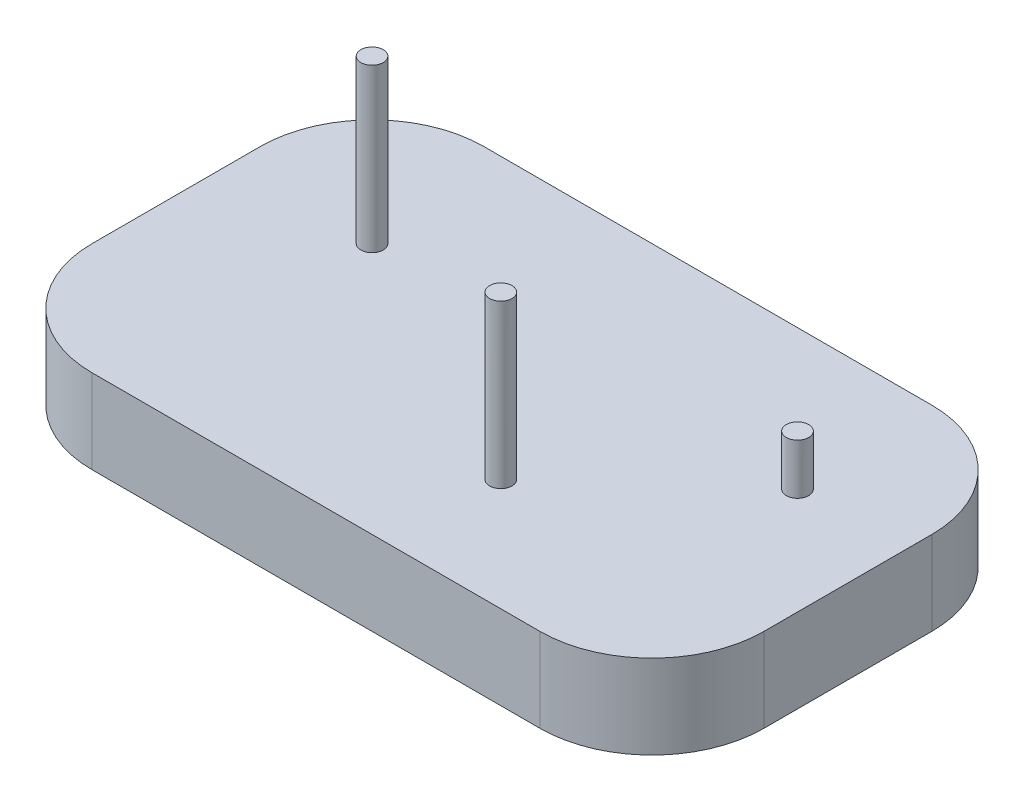
ISO-10303-21;
HEADER;
FILE_DESCRIPTION(('STEP AP214'),'2;1');
FILE_NAME('part.step','',(''),(''),'','','');
FILE_SCHEMA(('AUTOMOTIVE_DESIGN { 1 0 10303 214 1 1 1 1 }'));
ENDSEC;
DATA;
#1=APPLICATION_CONTEXT('core data for automotive mechanical design processes');
#2=APPLICATION_PROTOCOL_DEFINITION('international standard','automotive_design',2000,#1);
#3=PRODUCT_CONTEXT('',#1,'mechanical');
#4=PRODUCT('Part','Part','',(#3));
#5=PRODUCT_RELATED_PRODUCT_CATEGORY('part','',(#4));
#6=PRODUCT_DEFINITION_FORMATION('','',#4);
#7=PRODUCT_DEFINITION_CONTEXT('part definition',#1,'design');
#8=PRODUCT_DEFINITION('design','',#6,#7);
#9=PRODUCT_DEFINITION_SHAPE('','',#8);
#10=(LENGTH_UNIT() NAMED_UNIT(*) SI_UNIT(.MILLI.,.METRE.));
#11=(NAMED_UNIT(*) PLANE_ANGLE_UNIT() SI_UNIT($,.RADIAN.));
#12=(NAMED_UNIT(*) SI_UNIT($,.STERADIAN.) SOLID_ANGLE_UNIT());
#13=UNCERTAINTY_MEASURE_WITH_UNIT(LENGTH_MEASURE(1.E-05),#10,'distance_accuracy_value','');
#14=(GEOMETRIC_REPRESENTATION_CONTEXT(3) GLOBAL_UNCERTAINTY_ASSIGNED_CONTEXT((#13)) GLOBAL_UNIT_ASSIGNED_CONTEXT((#10,
#11,#12)) REPRESENTATION_CONTEXT('',''));
#15=CARTESIAN_POINT('',(0.,0.,0.));
#16=DIRECTION('',(0.,0.,1.));
#17=DIRECTION('',(1.,0.,0.));
#18=AXIS2_PLACEMENT_3D('',#15,#16,#17);
#19=CARTESIAN_POINT('',(0.,15.,0.));
#20=DIRECTION('',(1.,0.,0.));
#21=DIRECTION('',(0.,0.,-1.));
#22=AXIS2_PLACEMENT_3D('',#19,#20,#21);
#23=PLANE('',#22);
#24=DIRECTION('',(0.,0.,1.));
#25=VECTOR('',#24,1.);
#26=CARTESIAN_POINT('',(0.,15.,0.));
#27=LINE('',#26,#25);
#28=CARTESIAN_POINT('',(0.,15.,-50.));
#29=VERTEX_POINT('',#28);
#30=CARTESIAN_POINT('',(0.,15.,-20.));
#31=VERTEX_POINT('',#30);
#32=EDGE_CURVE('E142',#29,#31,#27,.T.);
#33=ORIENTED_EDGE('',*,*,#32,.F.);
#34=DIRECTION('',(0.,-1.,0.));
#35=VECTOR('',#34,1.);
#36=CARTESIAN_POINT('',(0.,15.,-50.));
#37=LINE('',#36,#35);
#38=CARTESIAN_POINT('',(0.,0.,-50.));
#39=VERTEX_POINT('',#38);
#40=EDGE_CURVE('E181',#29,#39,#37,.T.);
#41=ORIENTED_EDGE('',*,*,#40,.T.);
#42=DIRECTION('',(0.,0.,1.));
#43=VECTOR('',#42,1.);
#44=CARTESIAN_POINT('',(0.,0.,0.));
#45=LINE('',#44,#43);
#46=CARTESIAN_POINT('',(0.,0.,-20.));
#47=VERTEX_POINT('',#46);
#48=EDGE_CURVE('E220',#39,#47,#45,.T.);
#49=ORIENTED_EDGE('',*,*,#48,.T.);
#50=DIRECTION('',(0.,-1.,0.));
#51=VECTOR('',#50,1.);
#52=CARTESIAN_POINT('',(0.,15.,-20.));
#53=LINE('',#52,#51);
#54=EDGE_CURVE('E178',#47,#31,#53,.F.);
#55=ORIENTED_EDGE('',*,*,#54,.T.);
#56=EDGE_LOOP('',(#33,#41,#49,#55));
#57=FACE_BOUND('',#56,.T.);
#58=ADVANCED_FACE('F45',(#57),#23,.F.);
#59=CARTESIAN_POINT('',(0.,15.,0.));
#60=DIRECTION('',(0.,0.,-1.));
#61=DIRECTION('',(-1.,0.,0.));
#62=AXIS2_PLACEMENT_3D('',#59,#60,#61);
#63=PLANE('',#62);
#64=DIRECTION('',(1.,0.,0.));
#65=VECTOR('',#64,1.);
#66=CARTESIAN_POINT('',(0.,15.,0.));
#67=LINE('',#66,#65);
#68=CARTESIAN_POINT('',(20.,15.,0.));
#69=VERTEX_POINT('',#68);
#70=CARTESIAN_POINT('',(100.,15.,0.));
#71=VERTEX_POINT('',#70);
#72=EDGE_CURVE('E147',#69,#71,#67,.T.);
#73=ORIENTED_EDGE('',*,*,#72,.F.);
#74=DIRECTION('',(0.,-1.,0.));
#75=VECTOR('',#74,1.);
#76=CARTESIAN_POINT('',(20.,15.,0.));
#77=LINE('',#76,#75);
#78=CARTESIAN_POINT('',(20.,0.,0.));
#79=VERTEX_POINT('',#78);
#80=EDGE_CURVE('E187',#69,#79,#77,.T.);
#81=ORIENTED_EDGE('',*,*,#80,.T.);
#82=DIRECTION('',(1.,0.,0.));
#83=VECTOR('',#82,1.);
#84=CARTESIAN_POINT('',(0.,0.,0.));
#85=LINE('',#84,#83);
#86=CARTESIAN_POINT('',(100.,0.,0.));
#87=VERTEX_POINT('',#86);
#88=EDGE_CURVE('E149',#79,#87,#85,.T.);
#89=ORIENTED_EDGE('',*,*,#88,.T.);
#90=DIRECTION('',(0.,-1.,0.));
#91=VECTOR('',#90,1.);
#92=CARTESIAN_POINT('',(100.,15.,0.));
#93=LINE('',#92,#91);
#94=EDGE_CURVE('E61',#87,#71,#93,.F.);
#95=ORIENTED_EDGE('',*,*,#94,.T.);
#96=EDGE_LOOP('',(#73,#81,#89,#95));
#97=FACE_BOUND('',#96,.T.);
#98=ADVANCED_FACE('F226',(#97),#63,.F.);
#99=CARTESIAN_POINT('',(120.,15.,0.));
#100=DIRECTION('',(-1.,0.,0.));
#101=DIRECTION('',(0.,0.,1.));
#102=AXIS2_PLACEMENT_3D('',#99,#100,#101);
#103=PLANE('',#102);
#104=DIRECTION('',(0.,0.,-1.));
#105=VECTOR('',#104,1.);
#106=CARTESIAN_POINT('',(120.,0.,0.));
#107=LINE('',#106,#105);
#108=CARTESIAN_POINT('',(120.,0.,-20.));
#109=VERTEX_POINT('',#108);
#110=CARTESIAN_POINT('',(120.,0.,-50.));
#111=VERTEX_POINT('',#110);
#112=EDGE_CURVE('E143',#109,#111,#107,.T.);
#113=ORIENTED_EDGE('',*,*,#112,.T.);
#114=DIRECTION('',(0.,-1.,0.));
#115=VECTOR('',#114,1.);
#116=CARTESIAN_POINT('',(120.,15.,-50.));
#117=LINE('',#116,#115);
#118=CARTESIAN_POINT('',(120.,15.,-50.));
#119=VERTEX_POINT('',#118);
#120=EDGE_CURVE('E118',#111,#119,#117,.F.);
#121=ORIENTED_EDGE('',*,*,#120,.T.);
#122=DIRECTION('',(0.,0.,-1.));
#123=VECTOR('',#122,1.);
#124=CARTESIAN_POINT('',(120.,15.,0.));
#125=LINE('',#124,#123);
#126=CARTESIAN_POINT('',(120.,15.,-20.));
#127=VERTEX_POINT('',#126);
#128=EDGE_CURVE('E209',#127,#119,#125,.T.);
#129=ORIENTED_EDGE('',*,*,#128,.F.);
#130=DIRECTION('',(0.,-1.,0.));
#131=VECTOR('',#130,1.);
#132=CARTESIAN_POINT('',(120.,15.,-20.));
#133=LINE('',#132,#131);
#134=EDGE_CURVE('E124',#127,#109,#133,.T.);
#135=ORIENTED_EDGE('',*,*,#134,.T.);
#136=EDGE_LOOP('',(#113,#121,#129,#135));
#137=FACE_BOUND('',#136,.T.);
#138=ADVANCED_FACE('F229',(#137),#103,.F.);
#139=CARTESIAN_POINT('',(0.,15.,-70.));
#140=DIRECTION('',(0.,0.,1.));
#141=DIRECTION('',(1.,0.,0.));
#142=AXIS2_PLACEMENT_3D('',#139,#140,#141);
#143=PLANE('',#142);
#144=DIRECTION('',(-1.,0.,0.));
#145=VECTOR('',#144,1.);
#146=CARTESIAN_POINT('',(0.,15.,-70.));
#147=LINE('',#146,#145);
#148=CARTESIAN_POINT('',(100.,15.,-70.));
#149=VERTEX_POINT('',#148);
#150=CARTESIAN_POINT('',(20.,15.,-70.));
#151=VERTEX_POINT('',#150);
#152=EDGE_CURVE('E134',#149,#151,#147,.T.);
#153=ORIENTED_EDGE('',*,*,#152,.F.);
#154=DIRECTION('',(0.,-1.,0.));
#155=VECTOR('',#154,1.);
#156=CARTESIAN_POINT('',(100.,15.,-70.));
#157=LINE('',#156,#155);
#158=CARTESIAN_POINT('',(100.,0.,-70.));
#159=VERTEX_POINT('',#158);
#160=EDGE_CURVE('E117',#149,#159,#157,.T.);
#161=ORIENTED_EDGE('',*,*,#160,.T.);
#162=DIRECTION('',(-1.,0.,0.));
#163=VECTOR('',#162,1.);
#164=CARTESIAN_POINT('',(0.,0.,-70.));
#165=LINE('',#164,#163);
#166=CARTESIAN_POINT('',(20.,0.,-70.));
#167=VERTEX_POINT('',#166);
#168=EDGE_CURVE('E131',#159,#167,#165,.T.);
#169=ORIENTED_EDGE('',*,*,#168,.T.);
#170=DIRECTION('',(0.,-1.,0.));
#171=VECTOR('',#170,1.);
#172=CARTESIAN_POINT('',(20.,15.,-70.));
#173=LINE('',#172,#171);
#174=EDGE_CURVE('E137',#167,#151,#173,.F.);
#175=ORIENTED_EDGE('',*,*,#174,.T.);
#176=EDGE_LOOP('',(#153,#161,#169,#175));
#177=FACE_BOUND('',#176,.T.);
#178=ADVANCED_FACE('F130',(#177),#143,.F.);
#179=CARTESIAN_POINT('',(0.,15.,0.));
#180=DIRECTION('',(0.,-1.,0.));
#181=DIRECTION('',(0.,0.,-1.));
#182=AXIS2_PLACEMENT_3D('',#179,#180,#181);
#183=PLANE('',#182);
#184=CARTESIAN_POINT('',(101.,15.,-45.));
#185=DIRECTION('',(0.,-1.,0.));
#186=DIRECTION('',(0.,0.,-1.));
#187=AXIS2_PLACEMENT_3D('',#184,#185,#186);
#188=CIRCLE('',#187,2.);
#189=CARTESIAN_POINT('',(101.,15.,-47.));
#190=VERTEX_POINT('',#189);
#191=EDGE_CURVE('E11',#190,#190,#188,.F.);
#192=ORIENTED_EDGE('',*,*,#191,.F.);
#193=EDGE_LOOP('',(#192));
#194=FACE_BOUND('',#193,.T.);
#195=CARTESIAN_POINT('',(73.,15.,-20.));
#196=DIRECTION('',(0.,-1.,0.));
#197=DIRECTION('',(0.,0.,-1.));
#198=AXIS2_PLACEMENT_3D('',#195,#196,#197);
#199=CIRCLE('',#198,2.);
#200=CARTESIAN_POINT('',(73.,15.,-22.));
#201=VERTEX_POINT('',#200);
#202=EDGE_CURVE('E54',#201,#201,#199,.F.);
#203=ORIENTED_EDGE('',*,*,#202,.F.);
#204=EDGE_LOOP('',(#203));
#205=FACE_BOUND('',#204,.T.);
#206=CARTESIAN_POINT('',(25.,15.,-45.));
#207=DIRECTION('',(0.,-1.,0.));
#208=DIRECTION('',(0.,0.,-1.));
#209=AXIS2_PLACEMENT_3D('',#206,#207,#208);
#210=CIRCLE('',#209,2.00000000000001);
#211=CARTESIAN_POINT('',(25.,15.,-47.));
#212=VERTEX_POINT('',#211);
#213=EDGE_CURVE('E191',#212,#212,#210,.F.);
#214=ORIENTED_EDGE('',*,*,#213,.F.);
#215=EDGE_LOOP('',(#214));
#216=FACE_BOUND('',#215,.T.);
#217=ORIENTED_EDGE('',*,*,#128,.T.);
#218=CARTESIAN_POINT('',(100.,15.,-50.));
#219=DIRECTION('',(0.,-1.,0.));
#220=DIRECTION('',(0.,0.,-1.));
#221=AXIS2_PLACEMENT_3D('',#218,#219,#220);
#222=CIRCLE('',#221,20.);
#223=EDGE_CURVE('E175',#119,#149,#222,.F.);
#224=ORIENTED_EDGE('',*,*,#223,.T.);
#225=ORIENTED_EDGE('',*,*,#152,.T.);
#226=CARTESIAN_POINT('',(20.,15.,-50.));
#227=DIRECTION('',(0.,-1.,0.));
#228=DIRECTION('',(0.,0.,-1.));
#229=AXIS2_PLACEMENT_3D('',#226,#227,#228);
#230=CIRCLE('',#229,20.);
#231=EDGE_CURVE('E172',#151,#29,#230,.F.);
#232=ORIENTED_EDGE('',*,*,#231,.T.);
#233=ORIENTED_EDGE('',*,*,#32,.T.);
#234=CARTESIAN_POINT('',(20.,15.,-20.));
#235=DIRECTION('',(0.,-1.,0.));
#236=DIRECTION('',(0.,0.,-1.));
#237=AXIS2_PLACEMENT_3D('',#234,#235,#236);
#238=CIRCLE('',#237,20.);
#239=EDGE_CURVE('E68',#31,#69,#238,.F.);
#240=ORIENTED_EDGE('',*,*,#239,.T.);
#241=ORIENTED_EDGE('',*,*,#72,.T.);
#242=CARTESIAN_POINT('',(100.,15.,-20.));
#243=DIRECTION('',(0.,-1.,0.));
#244=DIRECTION('',(0.,0.,-1.));
#245=AXIS2_PLACEMENT_3D('',#242,#243,#244);
#246=CIRCLE('',#245,20.);
#247=EDGE_CURVE('E167',#71,#127,#246,.F.);
#248=ORIENTED_EDGE('',*,*,#247,.T.);
#249=EDGE_LOOP('',(#217,#224,#225,#232,#233,#240,#241,#248));
#250=FACE_BOUND('',#249,.T.);
#251=ADVANCED_FACE('F201',(#194,#205,#216,#250),#183,.F.);
#252=CARTESIAN_POINT('',(0.,0.,0.));
#253=DIRECTION('',(0.,-1.,0.));
#254=DIRECTION('',(0.,0.,-1.));
#255=AXIS2_PLACEMENT_3D('',#252,#253,#254);
#256=PLANE('',#255);
#257=ORIENTED_EDGE('',*,*,#168,.F.);
#258=CARTESIAN_POINT('',(100.,0.,-50.));
#259=DIRECTION('',(0.,-1.,0.));
#260=DIRECTION('',(0.,0.,-1.));
#261=AXIS2_PLACEMENT_3D('',#258,#259,#260);
#262=CIRCLE('',#261,20.);
#263=EDGE_CURVE('E113',#159,#111,#262,.T.);
#264=ORIENTED_EDGE('',*,*,#263,.T.);
#265=ORIENTED_EDGE('',*,*,#112,.F.);
#266=CARTESIAN_POINT('',(100.,0.,-20.));
#267=DIRECTION('',(0.,-1.,0.));
#268=DIRECTION('',(0.,0.,-1.));
#269=AXIS2_PLACEMENT_3D('',#266,#267,#268);
#270=CIRCLE('',#269,20.);
#271=EDGE_CURVE('E136',#109,#87,#270,.T.);
#272=ORIENTED_EDGE('',*,*,#271,.T.);
#273=ORIENTED_EDGE('',*,*,#88,.F.);
#274=CARTESIAN_POINT('',(20.,0.,-20.));
#275=DIRECTION('',(0.,-1.,0.));
#276=DIRECTION('',(0.,0.,-1.));
#277=AXIS2_PLACEMENT_3D('',#274,#275,#276);
#278=CIRCLE('',#277,20.);
#279=EDGE_CURVE('E157',#79,#47,#278,.T.);
#280=ORIENTED_EDGE('',*,*,#279,.T.);
#281=ORIENTED_EDGE('',*,*,#48,.F.);
#282=CARTESIAN_POINT('',(20.,0.,-50.));
#283=DIRECTION('',(0.,-1.,0.));
#284=DIRECTION('',(0.,0.,-1.));
#285=AXIS2_PLACEMENT_3D('',#282,#283,#284);
#286=CIRCLE('',#285,20.);
#287=EDGE_CURVE('E125',#39,#167,#286,.T.);
#288=ORIENTED_EDGE('',*,*,#287,.T.);
#289=EDGE_LOOP('',(#257,#264,#265,#272,#273,#280,#281,#288));
#290=FACE_BOUND('',#289,.T.);
#291=ADVANCED_FACE('F139',(#290),#256,.T.);
#292=CARTESIAN_POINT('',(100.,15.,-50.));
#293=DIRECTION('',(0.,-1.,0.));
#294=DIRECTION('',(0.,0.,-1.));
#295=AXIS2_PLACEMENT_3D('',#292,#293,#294);
#296=CYLINDRICAL_SURFACE('',#295,20.);
#297=ORIENTED_EDGE('',*,*,#223,.F.);
#298=ORIENTED_EDGE('',*,*,#120,.F.);
#299=ORIENTED_EDGE('',*,*,#263,.F.);
#300=ORIENTED_EDGE('',*,*,#160,.F.);
#301=EDGE_LOOP('',(#297,#298,#299,#300));
#302=FACE_BOUND('',#301,.T.);
#303=ADVANCED_FACE('F116',(#302),#296,.T.);
#304=CARTESIAN_POINT('',(20.,15.,-50.));
#305=DIRECTION('',(0.,-1.,0.));
#306=DIRECTION('',(0.,0.,-1.));
#307=AXIS2_PLACEMENT_3D('',#304,#305,#306);
#308=CYLINDRICAL_SURFACE('',#307,20.);
#309=ORIENTED_EDGE('',*,*,#231,.F.);
#310=ORIENTED_EDGE('',*,*,#174,.F.);
#311=ORIENTED_EDGE('',*,*,#287,.F.);
#312=ORIENTED_EDGE('',*,*,#40,.F.);
#313=EDGE_LOOP('',(#309,#310,#311,#312));
#314=FACE_BOUND('',#313,.T.);
#315=ADVANCED_FACE('F247',(#314),#308,.T.);
#316=CARTESIAN_POINT('',(20.,15.,-20.));
#317=DIRECTION('',(0.,-1.,0.));
#318=DIRECTION('',(0.,0.,-1.));
#319=AXIS2_PLACEMENT_3D('',#316,#317,#318);
#320=CYLINDRICAL_SURFACE('',#319,20.);
#321=ORIENTED_EDGE('',*,*,#239,.F.);
#322=ORIENTED_EDGE('',*,*,#54,.F.);
#323=ORIENTED_EDGE('',*,*,#279,.F.);
#324=ORIENTED_EDGE('',*,*,#80,.F.);
#325=EDGE_LOOP('',(#321,#322,#323,#324));
#326=FACE_BOUND('',#325,.T.);
#327=ADVANCED_FACE('F249',(#326),#320,.T.);
#328=CARTESIAN_POINT('',(100.,15.,-20.));
#329=DIRECTION('',(0.,-1.,0.));
#330=DIRECTION('',(0.,0.,-1.));
#331=AXIS2_PLACEMENT_3D('',#328,#329,#330);
#332=CYLINDRICAL_SURFACE('',#331,20.);
#333=ORIENTED_EDGE('',*,*,#247,.F.);
#334=ORIENTED_EDGE('',*,*,#94,.F.);
#335=ORIENTED_EDGE('',*,*,#271,.F.);
#336=ORIENTED_EDGE('',*,*,#134,.F.);
#337=EDGE_LOOP('',(#333,#334,#335,#336));
#338=FACE_BOUND('',#337,.T.);
#339=ADVANCED_FACE('F47',(#338),#332,.T.);
#340=CARTESIAN_POINT('',(25.,24.,-45.));
#341=DIRECTION('',(0.,-1.,0.));
#342=DIRECTION('',(0.,0.,-1.));
#343=AXIS2_PLACEMENT_3D('',#340,#341,#342);
#344=CYLINDRICAL_SURFACE('',#343,2.00000000000001);
#345=ORIENTED_EDGE('',*,*,#213,.T.);
#346=EDGE_LOOP('',(#345));
#347=FACE_BOUND('',#346,.T.);
#348=CARTESIAN_POINT('',(25.,44.,-45.));
#349=DIRECTION('',(0.,1.,0.));
#350=DIRECTION('',(0.,0.,1.));
#351=AXIS2_PLACEMENT_3D('',#348,#349,#350);
#352=CIRCLE('',#351,2.00000000000001);
#353=CARTESIAN_POINT('',(25.,44.,-43.));
#354=VERTEX_POINT('',#353);
#355=EDGE_CURVE('E416',#354,#354,#352,.T.);
#356=ORIENTED_EDGE('',*,*,#355,.F.);
#357=EDGE_LOOP('',(#356));
#358=FACE_BOUND('',#357,.T.);
#359=ADVANCED_FACE('F256',(#347,#358),#344,.T.);
#360=CARTESIAN_POINT('',(73.,24.,-20.));
#361=DIRECTION('',(0.,-1.,0.));
#362=DIRECTION('',(0.,0.,-1.));
#363=AXIS2_PLACEMENT_3D('',#360,#361,#362);
#364=CYLINDRICAL_SURFACE('',#363,2.);
#365=ORIENTED_EDGE('',*,*,#202,.T.);
#366=EDGE_LOOP('',(#365));
#367=FACE_BOUND('',#366,.T.);
#368=CARTESIAN_POINT('',(73.,44.,-20.));
#369=DIRECTION('',(0.,1.,0.));
#370=DIRECTION('',(0.,0.,1.));
#371=AXIS2_PLACEMENT_3D('',#368,#369,#370);
#372=CIRCLE('',#371,2.);
#373=CARTESIAN_POINT('',(73.,44.,-18.));
#374=VERTEX_POINT('',#373);
#375=EDGE_CURVE('E414',#374,#374,#372,.T.);
#376=ORIENTED_EDGE('',*,*,#375,.F.);
#377=EDGE_LOOP('',(#376));
#378=FACE_BOUND('',#377,.T.);
#379=ADVANCED_FACE('F198',(#367,#378),#364,.T.);
#380=CARTESIAN_POINT('',(101.,24.,-45.));
#381=DIRECTION('',(0.,-1.,0.));
#382=DIRECTION('',(0.,0.,-1.));
#383=AXIS2_PLACEMENT_3D('',#380,#381,#382);
#384=CYLINDRICAL_SURFACE('',#383,2.);
#385=CARTESIAN_POINT('',(101.,24.,-45.));
#386=DIRECTION('',(0.,1.,0.));
#387=DIRECTION('',(0.,0.,1.));
#388=AXIS2_PLACEMENT_3D('',#385,#386,#387);
#389=CIRCLE('',#388,2.);
#390=CARTESIAN_POINT('',(101.,24.,-43.));
#391=VERTEX_POINT('',#390);
#392=EDGE_CURVE('E223',#391,#391,#389,.T.);
#393=ORIENTED_EDGE('',*,*,#392,.F.);
#394=EDGE_LOOP('',(#393));
#395=FACE_BOUND('',#394,.T.);
#396=ORIENTED_EDGE('',*,*,#191,.T.);
#397=EDGE_LOOP('',(#396));
#398=FACE_BOUND('',#397,.T.);
#399=ADVANCED_FACE('F268',(#395,#398),#384,.T.);
#400=CARTESIAN_POINT('',(0.,24.,0.));
#401=DIRECTION('',(0.,1.,0.));
#402=DIRECTION('',(0.,0.,1.));
#403=AXIS2_PLACEMENT_3D('',#400,#401,#402);
#404=PLANE('',#403);
#405=ORIENTED_EDGE('',*,*,#392,.T.);
#406=EDGE_LOOP('',(#405));
#407=FACE_BOUND('',#406,.T.);
#408=ADVANCED_FACE('F314',(#407),#404,.T.);
#409=CARTESIAN_POINT('',(25.,44.,-45.));
#410=DIRECTION('',(0.,1.,0.));
#411=DIRECTION('',(0.,0.,1.));
#412=AXIS2_PLACEMENT_3D('',#409,#410,#411);
#413=PLANE('',#412);
#414=ORIENTED_EDGE('',*,*,#355,.T.);
#415=EDGE_LOOP('',(#414));
#416=FACE_BOUND('',#415,.T.);
#417=ADVANCED_FACE('F324',(#416),#413,.T.);
#418=CARTESIAN_POINT('',(73.,44.,-20.));
#419=DIRECTION('',(0.,1.,0.));
#420=DIRECTION('',(0.,0.,1.));
#421=AXIS2_PLACEMENT_3D('',#418,#419,#420);
#422=PLANE('',#421);
#423=ORIENTED_EDGE('',*,*,#375,.T.);
#424=EDGE_LOOP('',(#423));
#425=FACE_BOUND('',#424,.T.);
#426=ADVANCED_FACE('F346',(#425),#422,.T.);
#427=CLOSED_SHELL('',(#58,#98,#138,#178,#251,#291,#303,#315,#327,#339,#359,#379,#399,#408,#417,#426));
#428=MANIFOLD_SOLID_BREP('B2',#427);
#429=ADVANCED_BREP_SHAPE_REPRESENTATION('',(#18,#428),#14);
#430=SHAPE_DEFINITION_REPRESENTATION(#9,#429);
ENDSEC;
END-ISO-10303-21;
